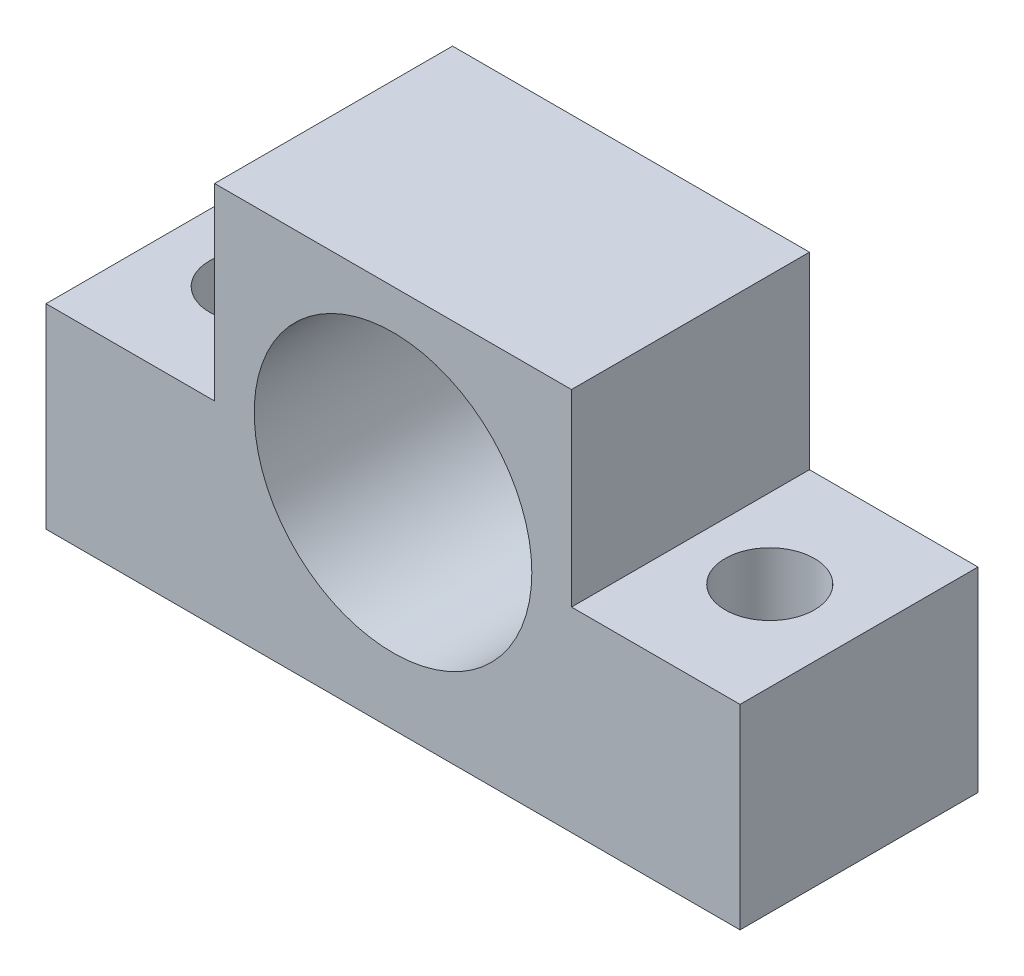
ISO-10303-21;
HEADER;
FILE_DESCRIPTION(('STEP AP214'),'2;1');
FILE_NAME('part.step','',(''),(''),'','','');
FILE_SCHEMA(('AUTOMOTIVE_DESIGN { 1 0 10303 214 1 1 1 1 }'));
ENDSEC;
DATA;
#1=APPLICATION_CONTEXT('core data for automotive mechanical design processes');
#2=APPLICATION_PROTOCOL_DEFINITION('international standard','automotive_design',2000,#1);
#3=PRODUCT_CONTEXT('',#1,'mechanical');
#4=PRODUCT('Part','Part','',(#3));
#5=PRODUCT_RELATED_PRODUCT_CATEGORY('part','',(#4));
#6=PRODUCT_DEFINITION_FORMATION('','',#4);
#7=PRODUCT_DEFINITION_CONTEXT('part definition',#1,'design');
#8=PRODUCT_DEFINITION('design','',#6,#7);
#9=PRODUCT_DEFINITION_SHAPE('','',#8);
#10=(LENGTH_UNIT() NAMED_UNIT(*) SI_UNIT(.MILLI.,.METRE.));
#11=(NAMED_UNIT(*) PLANE_ANGLE_UNIT() SI_UNIT($,.RADIAN.));
#12=(NAMED_UNIT(*) SI_UNIT($,.STERADIAN.) SOLID_ANGLE_UNIT());
#13=UNCERTAINTY_MEASURE_WITH_UNIT(LENGTH_MEASURE(1.E-05),#10,'distance_accuracy_value','');
#14=(GEOMETRIC_REPRESENTATION_CONTEXT(3) GLOBAL_UNCERTAINTY_ASSIGNED_CONTEXT((#13)) GLOBAL_UNIT_ASSIGNED_CONTEXT((#10,
#11,#12)) REPRESENTATION_CONTEXT('',''));
#15=CARTESIAN_POINT('',(0.,0.,0.));
#16=DIRECTION('',(0.,0.,1.));
#17=DIRECTION('',(1.,0.,0.));
#18=AXIS2_PLACEMENT_3D('',#15,#16,#17);
#19=CARTESIAN_POINT('',(0.,0.,24.));
#20=DIRECTION('',(0.,0.,-1.));
#21=DIRECTION('',(-1.,0.,0.));
#22=AXIS2_PLACEMENT_3D('',#19,#20,#21);
#23=PLANE('',#22);
#24=DIRECTION('',(-1.,0.,0.));
#25=VECTOR('',#24,1.);
#26=CARTESIAN_POINT('',(35.,19.7,24.));
#27=LINE('',#26,#25);
#28=CARTESIAN_POINT('',(35.,19.7,24.));
#29=VERTEX_POINT('',#28);
#30=CARTESIAN_POINT('',(18.,19.7,24.));
#31=VERTEX_POINT('',#30);
#32=EDGE_CURVE('E149',#29,#31,#27,.T.);
#33=ORIENTED_EDGE('',*,*,#32,.T.);
#34=DIRECTION('',(0.,1.,0.));
#35=VECTOR('',#34,1.);
#36=CARTESIAN_POINT('',(18.,19.7,24.));
#37=LINE('',#36,#35);
#38=CARTESIAN_POINT('',(18.,38.7,24.));
#39=VERTEX_POINT('',#38);
#40=EDGE_CURVE('E97',#31,#39,#37,.T.);
#41=ORIENTED_EDGE('',*,*,#40,.T.);
#42=DIRECTION('',(-1.,0.,0.));
#43=VECTOR('',#42,1.);
#44=CARTESIAN_POINT('',(18.,38.7,24.));
#45=LINE('',#44,#43);
#46=CARTESIAN_POINT('',(-18.,38.7,24.));
#47=VERTEX_POINT('',#46);
#48=EDGE_CURVE('E164',#39,#47,#45,.T.);
#49=ORIENTED_EDGE('',*,*,#48,.T.);
#50=DIRECTION('',(0.,-1.,0.));
#51=VECTOR('',#50,1.);
#52=CARTESIAN_POINT('',(-18.,38.7,24.));
#53=LINE('',#52,#51);
#54=CARTESIAN_POINT('',(-18.,19.7,24.));
#55=VERTEX_POINT('',#54);
#56=EDGE_CURVE('E177',#47,#55,#53,.T.);
#57=ORIENTED_EDGE('',*,*,#56,.T.);
#58=DIRECTION('',(-1.,0.,0.));
#59=VECTOR('',#58,1.);
#60=CARTESIAN_POINT('',(-18.,19.7,24.));
#61=LINE('',#60,#59);
#62=CARTESIAN_POINT('',(-35.,19.7,24.));
#63=VERTEX_POINT('',#62);
#64=EDGE_CURVE('E116',#55,#63,#61,.T.);
#65=ORIENTED_EDGE('',*,*,#64,.T.);
#66=DIRECTION('',(0.,-1.,0.));
#67=VECTOR('',#66,1.);
#68=CARTESIAN_POINT('',(-35.,19.7,24.));
#69=LINE('',#68,#67);
#70=CARTESIAN_POINT('',(-35.,0.,24.));
#71=VERTEX_POINT('',#70);
#72=EDGE_CURVE('E110',#63,#71,#69,.T.);
#73=ORIENTED_EDGE('',*,*,#72,.T.);
#74=DIRECTION('',(1.,0.,0.));
#75=VECTOR('',#74,1.);
#76=CARTESIAN_POINT('',(-35.,0.,24.));
#77=LINE('',#76,#75);
#78=CARTESIAN_POINT('',(35.,0.,24.));
#79=VERTEX_POINT('',#78);
#80=EDGE_CURVE('E114',#71,#79,#77,.T.);
#81=ORIENTED_EDGE('',*,*,#80,.T.);
#82=DIRECTION('',(0.,1.,0.));
#83=VECTOR('',#82,1.);
#84=CARTESIAN_POINT('',(35.,0.,24.));
#85=LINE('',#84,#83);
#86=EDGE_CURVE('E54',#79,#29,#85,.T.);
#87=ORIENTED_EDGE('',*,*,#86,.T.);
#88=EDGE_LOOP('',(#33,#41,#49,#57,#65,#73,#81,#87));
#89=FACE_BOUND('',#88,.T.);
#90=CARTESIAN_POINT('',(0.,20.7,24.));
#91=DIRECTION('',(0.,0.,1.));
#92=DIRECTION('',(1.,0.,0.));
#93=AXIS2_PLACEMENT_3D('',#90,#91,#92);
#94=CIRCLE('',#93,14.);
#95=CARTESIAN_POINT('',(14.,20.7,24.));
#96=VERTEX_POINT('',#95);
#97=EDGE_CURVE('E138',#96,#96,#94,.T.);
#98=ORIENTED_EDGE('',*,*,#97,.F.);
#99=EDGE_LOOP('',(#98));
#100=FACE_BOUND('',#99,.T.);
#101=ADVANCED_FACE('F37',(#89,#100),#23,.F.);
#102=CARTESIAN_POINT('',(0.,0.,0.));
#103=DIRECTION('',(0.,0.,-1.));
#104=DIRECTION('',(-1.,0.,0.));
#105=AXIS2_PLACEMENT_3D('',#102,#103,#104);
#106=PLANE('',#105);
#107=DIRECTION('',(-1.,0.,0.));
#108=VECTOR('',#107,1.);
#109=CARTESIAN_POINT('',(35.,19.7,0.));
#110=LINE('',#109,#108);
#111=CARTESIAN_POINT('',(35.,19.7,0.));
#112=VERTEX_POINT('',#111);
#113=CARTESIAN_POINT('',(18.,19.7,0.));
#114=VERTEX_POINT('',#113);
#115=EDGE_CURVE('E134',#112,#114,#110,.T.);
#116=ORIENTED_EDGE('',*,*,#115,.F.);
#117=DIRECTION('',(0.,1.,0.));
#118=VECTOR('',#117,1.);
#119=CARTESIAN_POINT('',(35.,0.,0.));
#120=LINE('',#119,#118);
#121=CARTESIAN_POINT('',(35.,0.,0.));
#122=VERTEX_POINT('',#121);
#123=EDGE_CURVE('E89',#122,#112,#120,.T.);
#124=ORIENTED_EDGE('',*,*,#123,.F.);
#125=DIRECTION('',(1.,0.,0.));
#126=VECTOR('',#125,1.);
#127=CARTESIAN_POINT('',(-35.,0.,0.));
#128=LINE('',#127,#126);
#129=CARTESIAN_POINT('',(-35.,0.,0.));
#130=VERTEX_POINT('',#129);
#131=EDGE_CURVE('E83',#130,#122,#128,.T.);
#132=ORIENTED_EDGE('',*,*,#131,.F.);
#133=DIRECTION('',(0.,-1.,0.));
#134=VECTOR('',#133,1.);
#135=CARTESIAN_POINT('',(-35.,19.7,0.));
#136=LINE('',#135,#134);
#137=CARTESIAN_POINT('',(-35.,19.7,0.));
#138=VERTEX_POINT('',#137);
#139=EDGE_CURVE('E124',#138,#130,#136,.T.);
#140=ORIENTED_EDGE('',*,*,#139,.F.);
#141=DIRECTION('',(-1.,0.,0.));
#142=VECTOR('',#141,1.);
#143=CARTESIAN_POINT('',(-18.,19.7,0.));
#144=LINE('',#143,#142);
#145=CARTESIAN_POINT('',(-18.,19.7,0.));
#146=VERTEX_POINT('',#145);
#147=EDGE_CURVE('E144',#146,#138,#144,.T.);
#148=ORIENTED_EDGE('',*,*,#147,.F.);
#149=DIRECTION('',(0.,-1.,0.));
#150=VECTOR('',#149,1.);
#151=CARTESIAN_POINT('',(-18.,38.7,0.));
#152=LINE('',#151,#150);
#153=CARTESIAN_POINT('',(-18.,38.7,0.));
#154=VERTEX_POINT('',#153);
#155=EDGE_CURVE('E142',#154,#146,#152,.T.);
#156=ORIENTED_EDGE('',*,*,#155,.F.);
#157=DIRECTION('',(-1.,0.,0.));
#158=VECTOR('',#157,1.);
#159=CARTESIAN_POINT('',(18.,38.7,0.));
#160=LINE('',#159,#158);
#161=CARTESIAN_POINT('',(18.,38.7,0.));
#162=VERTEX_POINT('',#161);
#163=EDGE_CURVE('E140',#162,#154,#160,.T.);
#164=ORIENTED_EDGE('',*,*,#163,.F.);
#165=DIRECTION('',(0.,1.,0.));
#166=VECTOR('',#165,1.);
#167=CARTESIAN_POINT('',(18.,19.7,0.));
#168=LINE('',#167,#166);
#169=EDGE_CURVE('E137',#114,#162,#168,.T.);
#170=ORIENTED_EDGE('',*,*,#169,.F.);
#171=EDGE_LOOP('',(#116,#124,#132,#140,#148,#156,#164,#170));
#172=FACE_BOUND('',#171,.T.);
#173=CARTESIAN_POINT('',(0.,20.7,0.));
#174=DIRECTION('',(0.,0.,1.));
#175=DIRECTION('',(1.,0.,0.));
#176=AXIS2_PLACEMENT_3D('',#173,#174,#175);
#177=CIRCLE('',#176,14.);
#178=CARTESIAN_POINT('',(14.,20.7,0.));
#179=VERTEX_POINT('',#178);
#180=EDGE_CURVE('E183',#179,#179,#177,.T.);
#181=ORIENTED_EDGE('',*,*,#180,.T.);
#182=EDGE_LOOP('',(#181));
#183=FACE_BOUND('',#182,.T.);
#184=ADVANCED_FACE('F168',(#172,#183),#106,.T.);
#185=CARTESIAN_POINT('',(35.,19.7,24.));
#186=DIRECTION('',(0.,-1.,0.));
#187=DIRECTION('',(1.,0.,0.));
#188=AXIS2_PLACEMENT_3D('',#185,#186,#187);
#189=PLANE('',#188);
#190=CARTESIAN_POINT('',(26.,19.7,12.));
#191=DIRECTION('',(0.,1.,0.));
#192=DIRECTION('',(1.,0.,0.));
#193=AXIS2_PLACEMENT_3D('',#190,#191,#192);
#194=CIRCLE('',#193,4.5);
#195=CARTESIAN_POINT('',(30.5,19.7,12.));
#196=VERTEX_POINT('',#195);
#197=EDGE_CURVE('E192',#196,#196,#194,.T.);
#198=ORIENTED_EDGE('',*,*,#197,.F.);
#199=EDGE_LOOP('',(#198));
#200=FACE_BOUND('',#199,.T.);
#201=ORIENTED_EDGE('',*,*,#115,.T.);
#202=DIRECTION('',(0.,0.,-1.));
#203=VECTOR('',#202,1.);
#204=CARTESIAN_POINT('',(18.,19.7,24.));
#205=LINE('',#204,#203);
#206=EDGE_CURVE('E11',#31,#114,#205,.T.);
#207=ORIENTED_EDGE('',*,*,#206,.F.);
#208=ORIENTED_EDGE('',*,*,#32,.F.);
#209=DIRECTION('',(0.,0.,-1.));
#210=VECTOR('',#209,1.);
#211=CARTESIAN_POINT('',(35.,19.7,24.));
#212=LINE('',#211,#210);
#213=EDGE_CURVE('E130',#29,#112,#212,.T.);
#214=ORIENTED_EDGE('',*,*,#213,.T.);
#215=EDGE_LOOP('',(#201,#207,#208,#214));
#216=FACE_BOUND('',#215,.T.);
#217=ADVANCED_FACE('F39',(#200,#216),#189,.F.);
#218=CARTESIAN_POINT('',(18.,19.7,24.));
#219=DIRECTION('',(-1.,0.,0.));
#220=DIRECTION('',(0.,-1.,0.));
#221=AXIS2_PLACEMENT_3D('',#218,#219,#220);
#222=PLANE('',#221);
#223=ORIENTED_EDGE('',*,*,#169,.T.);
#224=DIRECTION('',(0.,0.,-1.));
#225=VECTOR('',#224,1.);
#226=CARTESIAN_POINT('',(18.,38.7,24.));
#227=LINE('',#226,#225);
#228=EDGE_CURVE('E46',#39,#162,#227,.T.);
#229=ORIENTED_EDGE('',*,*,#228,.F.);
#230=ORIENTED_EDGE('',*,*,#40,.F.);
#231=ORIENTED_EDGE('',*,*,#206,.T.);
#232=EDGE_LOOP('',(#223,#229,#230,#231));
#233=FACE_BOUND('',#232,.T.);
#234=ADVANCED_FACE('F305',(#233),#222,.F.);
#235=CARTESIAN_POINT('',(18.,38.7,24.));
#236=DIRECTION('',(0.,-1.,0.));
#237=DIRECTION('',(0.,0.,-1.));
#238=AXIS2_PLACEMENT_3D('',#235,#236,#237);
#239=PLANE('',#238);
#240=ORIENTED_EDGE('',*,*,#163,.T.);
#241=DIRECTION('',(0.,0.,-1.));
#242=VECTOR('',#241,1.);
#243=CARTESIAN_POINT('',(-18.,38.7,24.));
#244=LINE('',#243,#242);
#245=EDGE_CURVE('E156',#47,#154,#244,.T.);
#246=ORIENTED_EDGE('',*,*,#245,.F.);
#247=ORIENTED_EDGE('',*,*,#48,.F.);
#248=ORIENTED_EDGE('',*,*,#228,.T.);
#249=EDGE_LOOP('',(#240,#246,#247,#248));
#250=FACE_BOUND('',#249,.T.);
#251=ADVANCED_FACE('F162',(#250),#239,.F.);
#252=CARTESIAN_POINT('',(-18.,38.7,24.));
#253=DIRECTION('',(1.,0.,0.));
#254=DIRECTION('',(0.,1.,0.));
#255=AXIS2_PLACEMENT_3D('',#252,#253,#254);
#256=PLANE('',#255);
#257=ORIENTED_EDGE('',*,*,#155,.T.);
#258=DIRECTION('',(0.,0.,-1.));
#259=VECTOR('',#258,1.);
#260=CARTESIAN_POINT('',(-18.,19.7,24.));
#261=LINE('',#260,#259);
#262=EDGE_CURVE('E153',#55,#146,#261,.T.);
#263=ORIENTED_EDGE('',*,*,#262,.F.);
#264=ORIENTED_EDGE('',*,*,#56,.F.);
#265=ORIENTED_EDGE('',*,*,#245,.T.);
#266=EDGE_LOOP('',(#257,#263,#264,#265));
#267=FACE_BOUND('',#266,.T.);
#268=ADVANCED_FACE('F173',(#267),#256,.F.);
#269=CARTESIAN_POINT('',(-18.,19.7,24.));
#270=DIRECTION('',(0.,-1.,0.));
#271=DIRECTION('',(1.,0.,0.));
#272=AXIS2_PLACEMENT_3D('',#269,#270,#271);
#273=PLANE('',#272);
#274=CARTESIAN_POINT('',(-26.,19.7,12.));
#275=DIRECTION('',(0.,1.,0.));
#276=DIRECTION('',(-1.,0.,0.));
#277=AXIS2_PLACEMENT_3D('',#274,#275,#276);
#278=CIRCLE('',#277,4.5);
#279=CARTESIAN_POINT('',(-30.5,19.7,12.));
#280=VERTEX_POINT('',#279);
#281=EDGE_CURVE('E195',#280,#280,#278,.T.);
#282=ORIENTED_EDGE('',*,*,#281,.F.);
#283=EDGE_LOOP('',(#282));
#284=FACE_BOUND('',#283,.T.);
#285=ORIENTED_EDGE('',*,*,#147,.T.);
#286=DIRECTION('',(0.,0.,-1.));
#287=VECTOR('',#286,1.);
#288=CARTESIAN_POINT('',(-35.,19.7,24.));
#289=LINE('',#288,#287);
#290=EDGE_CURVE('E125',#63,#138,#289,.T.);
#291=ORIENTED_EDGE('',*,*,#290,.F.);
#292=ORIENTED_EDGE('',*,*,#64,.F.);
#293=ORIENTED_EDGE('',*,*,#262,.T.);
#294=EDGE_LOOP('',(#285,#291,#292,#293));
#295=FACE_BOUND('',#294,.T.);
#296=ADVANCED_FACE('F176',(#284,#295),#273,.F.);
#297=CARTESIAN_POINT('',(-35.,19.7,24.));
#298=DIRECTION('',(1.,0.,0.));
#299=DIRECTION('',(0.,0.,-1.));
#300=AXIS2_PLACEMENT_3D('',#297,#298,#299);
#301=PLANE('',#300);
#302=ORIENTED_EDGE('',*,*,#139,.T.);
#303=DIRECTION('',(0.,0.,-1.));
#304=VECTOR('',#303,1.);
#305=CARTESIAN_POINT('',(-35.,0.,24.));
#306=LINE('',#305,#304);
#307=EDGE_CURVE('E121',#71,#130,#306,.T.);
#308=ORIENTED_EDGE('',*,*,#307,.F.);
#309=ORIENTED_EDGE('',*,*,#72,.F.);
#310=ORIENTED_EDGE('',*,*,#290,.T.);
#311=EDGE_LOOP('',(#302,#308,#309,#310));
#312=FACE_BOUND('',#311,.T.);
#313=ADVANCED_FACE('F122',(#312),#301,.F.);
#314=CARTESIAN_POINT('',(-35.,0.,24.));
#315=DIRECTION('',(0.,1.,0.));
#316=DIRECTION('',(0.,0.,1.));
#317=AXIS2_PLACEMENT_3D('',#314,#315,#316);
#318=PLANE('',#317);
#319=CARTESIAN_POINT('',(-26.,0.,12.));
#320=DIRECTION('',(0.,1.,0.));
#321=DIRECTION('',(-1.,0.,0.));
#322=AXIS2_PLACEMENT_3D('',#319,#320,#321);
#323=CIRCLE('',#322,4.5);
#324=CARTESIAN_POINT('',(-30.5,0.,12.));
#325=VERTEX_POINT('',#324);
#326=EDGE_CURVE('E186',#325,#325,#323,.T.);
#327=ORIENTED_EDGE('',*,*,#326,.T.);
#328=EDGE_LOOP('',(#327));
#329=FACE_BOUND('',#328,.T.);
#330=CARTESIAN_POINT('',(26.,0.,12.));
#331=DIRECTION('',(0.,1.,0.));
#332=DIRECTION('',(1.,0.,0.));
#333=AXIS2_PLACEMENT_3D('',#330,#331,#332);
#334=CIRCLE('',#333,4.5);
#335=CARTESIAN_POINT('',(30.5,0.,12.));
#336=VERTEX_POINT('',#335);
#337=EDGE_CURVE('E189',#336,#336,#334,.T.);
#338=ORIENTED_EDGE('',*,*,#337,.T.);
#339=EDGE_LOOP('',(#338));
#340=FACE_BOUND('',#339,.T.);
#341=ORIENTED_EDGE('',*,*,#131,.T.);
#342=DIRECTION('',(0.,0.,-1.));
#343=VECTOR('',#342,1.);
#344=CARTESIAN_POINT('',(35.,0.,24.));
#345=LINE('',#344,#343);
#346=EDGE_CURVE('E126',#79,#122,#345,.T.);
#347=ORIENTED_EDGE('',*,*,#346,.F.);
#348=ORIENTED_EDGE('',*,*,#80,.F.);
#349=ORIENTED_EDGE('',*,*,#307,.T.);
#350=EDGE_LOOP('',(#341,#347,#348,#349));
#351=FACE_BOUND('',#350,.T.);
#352=ADVANCED_FACE('F128',(#329,#340,#351),#318,.F.);
#353=CARTESIAN_POINT('',(35.,0.,24.));
#354=DIRECTION('',(-1.,0.,0.));
#355=DIRECTION('',(0.,0.,1.));
#356=AXIS2_PLACEMENT_3D('',#353,#354,#355);
#357=PLANE('',#356);
#358=ORIENTED_EDGE('',*,*,#123,.T.);
#359=ORIENTED_EDGE('',*,*,#213,.F.);
#360=ORIENTED_EDGE('',*,*,#86,.F.);
#361=ORIENTED_EDGE('',*,*,#346,.T.);
#362=EDGE_LOOP('',(#358,#359,#360,#361));
#363=FACE_BOUND('',#362,.T.);
#364=ADVANCED_FACE('F228',(#363),#357,.F.);
#365=CARTESIAN_POINT('',(0.,20.7,24.));
#366=DIRECTION('',(0.,0.,-1.));
#367=DIRECTION('',(-1.,0.,0.));
#368=AXIS2_PLACEMENT_3D('',#365,#366,#367);
#369=CYLINDRICAL_SURFACE('',#368,14.);
#370=ORIENTED_EDGE('',*,*,#97,.T.);
#371=EDGE_LOOP('',(#370));
#372=FACE_BOUND('',#371,.T.);
#373=ORIENTED_EDGE('',*,*,#180,.F.);
#374=EDGE_LOOP('',(#373));
#375=FACE_BOUND('',#374,.T.);
#376=ADVANCED_FACE('F225',(#372,#375),#369,.F.);
#377=CARTESIAN_POINT('',(26.,0.,12.));
#378=DIRECTION('',(0.,1.,0.));
#379=DIRECTION('',(-1.,0.,0.));
#380=AXIS2_PLACEMENT_3D('',#377,#378,#379);
#381=CYLINDRICAL_SURFACE('',#380,4.5);
#382=ORIENTED_EDGE('',*,*,#337,.F.);
#383=EDGE_LOOP('',(#382));
#384=FACE_BOUND('',#383,.T.);
#385=ORIENTED_EDGE('',*,*,#197,.T.);
#386=EDGE_LOOP('',(#385));
#387=FACE_BOUND('',#386,.T.);
#388=ADVANCED_FACE('F206',(#384,#387),#381,.F.);
#389=CARTESIAN_POINT('',(-26.,0.,12.));
#390=DIRECTION('',(0.,1.,0.));
#391=DIRECTION('',(-1.,0.,0.));
#392=AXIS2_PLACEMENT_3D('',#389,#390,#391);
#393=CYLINDRICAL_SURFACE('',#392,4.5);
#394=ORIENTED_EDGE('',*,*,#326,.F.);
#395=EDGE_LOOP('',(#394));
#396=FACE_BOUND('',#395,.T.);
#397=ORIENTED_EDGE('',*,*,#281,.T.);
#398=EDGE_LOOP('',(#397));
#399=FACE_BOUND('',#398,.T.);
#400=ADVANCED_FACE('F203',(#396,#399),#393,.F.);
#401=CLOSED_SHELL('',(#101,#184,#217,#234,#251,#268,#296,#313,#352,#364,#376,#388,#400));
#402=MANIFOLD_SOLID_BREP('B2',#401);
#403=ADVANCED_BREP_SHAPE_REPRESENTATION('',(#18,#402),#14);
#404=SHAPE_DEFINITION_REPRESENTATION(#9,#403);
ENDSEC;
END-ISO-10303-21;
